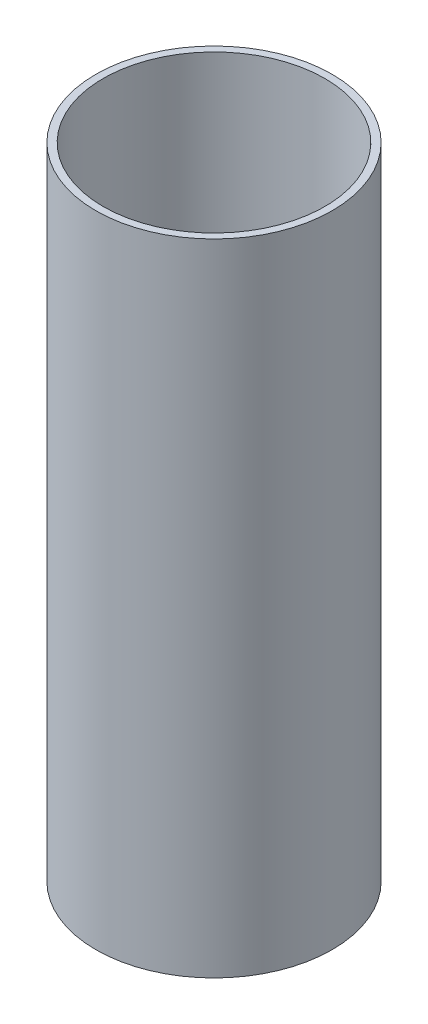
ISO-10303-21;
HEADER;
FILE_DESCRIPTION(('STEP AP214'),'2;1');
FILE_NAME('part.step','',(''),(''),'','','');
FILE_SCHEMA(('AUTOMOTIVE_DESIGN { 1 0 10303 214 1 1 1 1 }'));
ENDSEC;
DATA;
#1=APPLICATION_CONTEXT('core data for automotive mechanical design processes');
#2=APPLICATION_PROTOCOL_DEFINITION('international standard','automotive_design',2000,#1);
#3=PRODUCT_CONTEXT('',#1,'mechanical');
#4=PRODUCT('Part','Part','',(#3));
#5=PRODUCT_RELATED_PRODUCT_CATEGORY('part','',(#4));
#6=PRODUCT_DEFINITION_FORMATION('','',#4);
#7=PRODUCT_DEFINITION_CONTEXT('part definition',#1,'design');
#8=PRODUCT_DEFINITION('design','',#6,#7);
#9=PRODUCT_DEFINITION_SHAPE('','',#8);
#10=(LENGTH_UNIT() NAMED_UNIT(*) SI_UNIT(.MILLI.,.METRE.));
#11=(NAMED_UNIT(*) PLANE_ANGLE_UNIT() SI_UNIT($,.RADIAN.));
#12=(NAMED_UNIT(*) SI_UNIT($,.STERADIAN.) SOLID_ANGLE_UNIT());
#13=UNCERTAINTY_MEASURE_WITH_UNIT(LENGTH_MEASURE(1.E-05),#10,'distance_accuracy_value','');
#14=(GEOMETRIC_REPRESENTATION_CONTEXT(3) GLOBAL_UNCERTAINTY_ASSIGNED_CONTEXT((#13)) GLOBAL_UNIT_ASSIGNED_CONTEXT((#10,
#11,#12)) REPRESENTATION_CONTEXT('',''));
#15=CARTESIAN_POINT('',(0.,0.,0.));
#16=DIRECTION('',(0.,0.,1.));
#17=DIRECTION('',(1.,0.,0.));
#18=AXIS2_PLACEMENT_3D('',#15,#16,#17);
#19=CARTESIAN_POINT('',(0.,-13.97,0.));
#20=DIRECTION('',(0.,-1.,0.));
#21=DIRECTION('',(0.,0.,-1.));
#22=AXIS2_PLACEMENT_3D('',#19,#20,#21);
#23=CYLINDRICAL_SURFACE('',#22,48.41875);
#24=CARTESIAN_POINT('',(0.,0.,0.));
#25=DIRECTION('',(0.,-1.,0.));
#26=DIRECTION('',(0.,0.,-1.));
#27=AXIS2_PLACEMENT_3D('',#24,#25,#26);
#28=CIRCLE('',#27,48.41875);
#29=CARTESIAN_POINT('',(0.,0.,-48.41875));
#30=VERTEX_POINT('',#29);
#31=EDGE_CURVE('E58',#30,#30,#28,.T.);
#32=ORIENTED_EDGE('',*,*,#31,.T.);
#33=EDGE_LOOP('',(#32));
#34=FACE_BOUND('',#33,.T.);
#35=CARTESIAN_POINT('',(0.,279.4,0.));
#36=DIRECTION('',(0.,-1.,0.));
#37=DIRECTION('',(0.,0.,-1.));
#38=AXIS2_PLACEMENT_3D('',#35,#36,#37);
#39=CIRCLE('',#38,48.41875);
#40=CARTESIAN_POINT('',(0.,279.4,-48.41875));
#41=VERTEX_POINT('',#40);
#42=EDGE_CURVE('E10',#41,#41,#39,.T.);
#43=ORIENTED_EDGE('',*,*,#42,.F.);
#44=EDGE_LOOP('',(#43));
#45=FACE_BOUND('',#44,.T.);
#46=ADVANCED_FACE('F41',(#34,#45),#23,.F.);
#47=CARTESIAN_POINT('',(48.41875,279.4,0.));
#48=DIRECTION('',(0.,1.,0.));
#49=DIRECTION('',(0.,0.,1.));
#50=AXIS2_PLACEMENT_3D('',#47,#48,#49);
#51=PLANE('',#50);
#52=ORIENTED_EDGE('',*,*,#42,.T.);
#53=EDGE_LOOP('',(#52));
#54=FACE_BOUND('',#53,.T.);
#55=CARTESIAN_POINT('',(0.,279.4,0.));
#56=DIRECTION('',(0.,-1.,0.));
#57=DIRECTION('',(0.,0.,-1.));
#58=AXIS2_PLACEMENT_3D('',#55,#56,#57);
#59=CIRCLE('',#58,51.59375);
#60=CARTESIAN_POINT('',(0.,279.4,-51.59375));
#61=VERTEX_POINT('',#60);
#62=EDGE_CURVE('E48',#61,#61,#59,.T.);
#63=ORIENTED_EDGE('',*,*,#62,.F.);
#64=EDGE_LOOP('',(#63));
#65=FACE_BOUND('',#64,.T.);
#66=ADVANCED_FACE('F75',(#54,#65),#51,.T.);
#67=CARTESIAN_POINT('',(0.,-13.97,0.));
#68=DIRECTION('',(0.,-1.,0.));
#69=DIRECTION('',(0.,0.,-1.));
#70=AXIS2_PLACEMENT_3D('',#67,#68,#69);
#71=CYLINDRICAL_SURFACE('',#70,51.59375);
#72=ORIENTED_EDGE('',*,*,#62,.T.);
#73=EDGE_LOOP('',(#72));
#74=FACE_BOUND('',#73,.T.);
#75=CARTESIAN_POINT('',(0.,0.,0.));
#76=DIRECTION('',(0.,-1.,0.));
#77=DIRECTION('',(0.,0.,-1.));
#78=AXIS2_PLACEMENT_3D('',#75,#76,#77);
#79=CIRCLE('',#78,51.59375);
#80=CARTESIAN_POINT('',(0.,0.,-51.59375));
#81=VERTEX_POINT('',#80);
#82=EDGE_CURVE('E53',#81,#81,#79,.T.);
#83=ORIENTED_EDGE('',*,*,#82,.F.);
#84=EDGE_LOOP('',(#83));
#85=FACE_BOUND('',#84,.T.);
#86=ADVANCED_FACE('F69',(#74,#85),#71,.T.);
#87=CARTESIAN_POINT('',(48.41875,0.,0.));
#88=DIRECTION('',(0.,-1.,0.));
#89=DIRECTION('',(0.,0.,-1.));
#90=AXIS2_PLACEMENT_3D('',#87,#88,#89);
#91=PLANE('',#90);
#92=ORIENTED_EDGE('',*,*,#82,.T.);
#93=EDGE_LOOP('',(#92));
#94=FACE_BOUND('',#93,.T.);
#95=ORIENTED_EDGE('',*,*,#31,.F.);
#96=EDGE_LOOP('',(#95));
#97=FACE_BOUND('',#96,.T.);
#98=ADVANCED_FACE('F67',(#94,#97),#91,.T.);
#99=CLOSED_SHELL('',(#46,#66,#86,#98));
#100=MANIFOLD_SOLID_BREP('B2',#99);
#101=ADVANCED_BREP_SHAPE_REPRESENTATION('',(#18,#100),#14);
#102=SHAPE_DEFINITION_REPRESENTATION(#9,#101);
ENDSEC;
END-ISO-10303-21;
